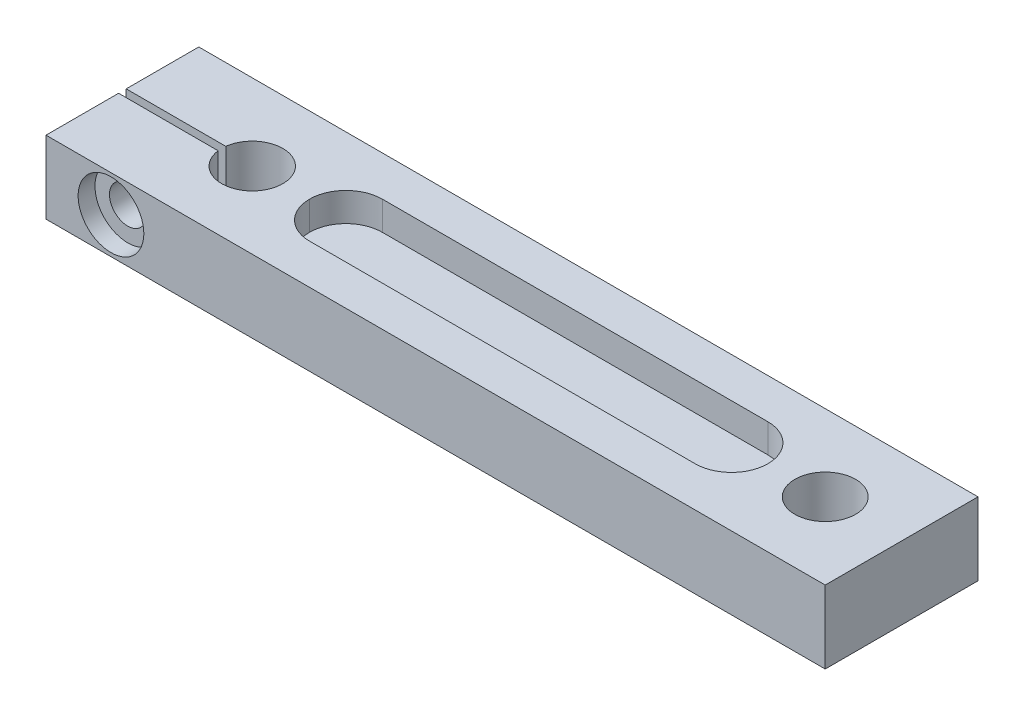
ISO-10303-21;
HEADER;
FILE_DESCRIPTION(('STEP AP214'),'2;1');
FILE_NAME('part.step','',(''),(''),'','','');
FILE_SCHEMA(('AUTOMOTIVE_DESIGN { 1 0 10303 214 1 1 1 1 }'));
ENDSEC;
DATA;
#1=APPLICATION_CONTEXT('core data for automotive mechanical design processes');
#2=APPLICATION_PROTOCOL_DEFINITION('international standard','automotive_design',2000,#1);
#3=PRODUCT_CONTEXT('',#1,'mechanical');
#4=PRODUCT('Part','Part','',(#3));
#5=PRODUCT_RELATED_PRODUCT_CATEGORY('part','',(#4));
#6=PRODUCT_DEFINITION_FORMATION('','',#4);
#7=PRODUCT_DEFINITION_CONTEXT('part definition',#1,'design');
#8=PRODUCT_DEFINITION('design','',#6,#7);
#9=PRODUCT_DEFINITION_SHAPE('','',#8);
#10=(LENGTH_UNIT() NAMED_UNIT(*) SI_UNIT(.MILLI.,.METRE.));
#11=(NAMED_UNIT(*) PLANE_ANGLE_UNIT() SI_UNIT($,.RADIAN.));
#12=(NAMED_UNIT(*) SI_UNIT($,.STERADIAN.) SOLID_ANGLE_UNIT());
#13=UNCERTAINTY_MEASURE_WITH_UNIT(LENGTH_MEASURE(1.E-05),#10,'distance_accuracy_value','');
#14=(GEOMETRIC_REPRESENTATION_CONTEXT(3) GLOBAL_UNCERTAINTY_ASSIGNED_CONTEXT((#13)) GLOBAL_UNIT_ASSIGNED_CONTEXT((#10,
#11,#12)) REPRESENTATION_CONTEXT('',''));
#15=CARTESIAN_POINT('',(0.,0.,0.));
#16=DIRECTION('',(0.,0.,1.));
#17=DIRECTION('',(1.,0.,0.));
#18=AXIS2_PLACEMENT_3D('',#15,#16,#17);
#19=CARTESIAN_POINT('',(-17.,34.925,0.));
#20=DIRECTION('',(-1.,0.,0.));
#21=DIRECTION('',(0.,0.,1.));
#22=AXIS2_PLACEMENT_3D('',#19,#20,#21);
#23=PLANE('',#22);
#24=DIRECTION('',(0.,1.,0.));
#25=VECTOR('',#24,1.);
#26=CARTESIAN_POINT('',(-17.,0.,-0.499999999999998));
#27=LINE('',#26,#25);
#28=CARTESIAN_POINT('',(-17.,25.4,-0.499999999999998));
#29=VERTEX_POINT('',#28);
#30=CARTESIAN_POINT('',(-17.,34.925,-0.499999999999998));
#31=VERTEX_POINT('',#30);
#32=EDGE_CURVE('E181',#29,#31,#27,.T.);
#33=ORIENTED_EDGE('',*,*,#32,.T.);
#34=DIRECTION('',(0.,0.,-1.));
#35=VECTOR('',#34,1.);
#36=CARTESIAN_POINT('',(-17.,34.925,0.));
#37=LINE('',#36,#35);
#38=CARTESIAN_POINT('',(-17.,34.925,-10.));
#39=VERTEX_POINT('',#38);
#40=EDGE_CURVE('E201',#31,#39,#37,.T.);
#41=ORIENTED_EDGE('',*,*,#40,.T.);
#42=DIRECTION('',(0.,-1.,0.));
#43=VECTOR('',#42,1.);
#44=CARTESIAN_POINT('',(-17.,34.925,-10.));
#45=LINE('',#44,#43);
#46=CARTESIAN_POINT('',(-17.,25.4,-10.));
#47=VERTEX_POINT('',#46);
#48=EDGE_CURVE('E222',#39,#47,#45,.T.);
#49=ORIENTED_EDGE('',*,*,#48,.T.);
#50=DIRECTION('',(0.,0.,-1.));
#51=VECTOR('',#50,1.);
#52=CARTESIAN_POINT('',(-17.,25.4,0.));
#53=LINE('',#52,#51);
#54=EDGE_CURVE('E218',#29,#47,#53,.T.);
#55=ORIENTED_EDGE('',*,*,#54,.F.);
#56=EDGE_LOOP('',(#33,#41,#49,#55));
#57=FACE_BOUND('',#56,.T.);
#58=ADVANCED_FACE('F39',(#57),#23,.T.);
#59=CARTESIAN_POINT('',(0.,34.925,0.));
#60=DIRECTION('',(0.,-1.,0.));
#61=DIRECTION('',(0.,0.,-1.));
#62=AXIS2_PLACEMENT_3D('',#59,#60,#61);
#63=PLANE('',#62);
#64=ORIENTED_EDGE('',*,*,#40,.F.);
#65=DIRECTION('',(-1.,0.,0.));
#66=VECTOR('',#65,1.);
#67=CARTESIAN_POINT('',(-17.,34.925,-0.499999999999998));
#68=LINE('',#67,#66);
#69=CARTESIAN_POINT('',(-3.96862696659689,34.925,-0.5));
#70=VERTEX_POINT('',#69);
#71=EDGE_CURVE('E182',#70,#31,#68,.T.);
#72=ORIENTED_EDGE('',*,*,#71,.F.);
#73=CARTESIAN_POINT('',(0.,34.925,0.));
#74=DIRECTION('',(0.,-1.,0.));
#75=DIRECTION('',(0.,0.,-1.));
#76=AXIS2_PLACEMENT_3D('',#73,#74,#75);
#77=CIRCLE('',#76,4.);
#78=CARTESIAN_POINT('',(-3.96862696659689,34.925,0.5));
#79=VERTEX_POINT('',#78);
#80=EDGE_CURVE('E194',#70,#79,#77,.T.);
#81=ORIENTED_EDGE('',*,*,#80,.T.);
#82=DIRECTION('',(1.,0.,0.));
#83=VECTOR('',#82,1.);
#84=CARTESIAN_POINT('',(-17.,34.925,0.500000000000002));
#85=LINE('',#84,#83);
#86=CARTESIAN_POINT('',(-17.,34.925,0.500000000000002));
#87=VERTEX_POINT('',#86);
#88=EDGE_CURVE('E61',#87,#79,#85,.T.);
#89=ORIENTED_EDGE('',*,*,#88,.F.);
#90=CARTESIAN_POINT('',(-17.,34.925,10.));
#91=VERTEX_POINT('',#90);
#92=EDGE_CURVE('E191',#91,#87,#37,.T.);
#93=ORIENTED_EDGE('',*,*,#92,.F.);
#94=DIRECTION('',(-1.,0.,0.));
#95=VECTOR('',#94,1.);
#96=CARTESIAN_POINT('',(0.,34.925,10.));
#97=LINE('',#96,#95);
#98=CARTESIAN_POINT('',(85.,34.925,10.));
#99=VERTEX_POINT('',#98);
#100=EDGE_CURVE('E205',#99,#91,#97,.T.);
#101=ORIENTED_EDGE('',*,*,#100,.F.);
#102=DIRECTION('',(0.,0.,1.));
#103=VECTOR('',#102,1.);
#104=CARTESIAN_POINT('',(85.,34.925,0.));
#105=LINE('',#104,#103);
#106=CARTESIAN_POINT('',(85.,34.925,-10.));
#107=VERTEX_POINT('',#106);
#108=EDGE_CURVE('E336',#107,#99,#105,.T.);
#109=ORIENTED_EDGE('',*,*,#108,.F.);
#110=DIRECTION('',(1.,0.,0.));
#111=VECTOR('',#110,1.);
#112=CARTESIAN_POINT('',(0.,34.925,-10.));
#113=LINE('',#112,#111);
#114=EDGE_CURVE('E221',#39,#107,#113,.T.);
#115=ORIENTED_EDGE('',*,*,#114,.F.);
#116=EDGE_LOOP('',(#64,#72,#81,#89,#93,#101,#109,#115));
#117=FACE_BOUND('',#116,.T.);
#118=CARTESIAN_POINT('',(75.,34.925,0.));
#119=DIRECTION('',(0.,-1.,0.));
#120=DIRECTION('',(0.,0.,-1.));
#121=AXIS2_PLACEMENT_3D('',#118,#119,#120);
#122=CIRCLE('',#121,3.97500000000001);
#123=CARTESIAN_POINT('',(75.,34.925,-3.97500000000001));
#124=VERTEX_POINT('',#123);
#125=EDGE_CURVE('E328',#124,#124,#122,.T.);
#126=ORIENTED_EDGE('',*,*,#125,.T.);
#127=EDGE_LOOP('',(#126));
#128=FACE_BOUND('',#127,.T.);
#129=DIRECTION('',(-1.,0.,0.));
#130=VECTOR('',#129,1.);
#131=CARTESIAN_POINT('',(0.,34.925,-4.7625));
#132=LINE('',#131,#130);
#133=CARTESIAN_POINT('',(62.7375,34.925,-4.7625));
#134=VERTEX_POINT('',#133);
#135=CARTESIAN_POINT('',(12.2625,34.925,-4.7625));
#136=VERTEX_POINT('',#135);
#137=EDGE_CURVE('E316',#134,#136,#132,.T.);
#138=ORIENTED_EDGE('',*,*,#137,.F.);
#139=CARTESIAN_POINT('',(62.7375,34.925,0.));
#140=DIRECTION('',(0.,-1.,0.));
#141=DIRECTION('',(0.,0.,-1.));
#142=AXIS2_PLACEMENT_3D('',#139,#140,#141);
#143=CIRCLE('',#142,4.7625);
#144=CARTESIAN_POINT('',(67.5,34.925,0.));
#145=VERTEX_POINT('',#144);
#146=EDGE_CURVE('E273',#134,#145,#143,.T.);
#147=ORIENTED_EDGE('',*,*,#146,.T.);
#148=CARTESIAN_POINT('',(62.7375,34.925,0.));
#149=DIRECTION('',(0.,-1.,0.));
#150=DIRECTION('',(0.,0.,-1.));
#151=AXIS2_PLACEMENT_3D('',#148,#149,#150);
#152=CIRCLE('',#151,4.7625);
#153=CARTESIAN_POINT('',(62.7375,34.925,4.7625));
#154=VERTEX_POINT('',#153);
#155=EDGE_CURVE('E271',#145,#154,#152,.T.);
#156=ORIENTED_EDGE('',*,*,#155,.T.);
#157=DIRECTION('',(1.,0.,0.));
#158=VECTOR('',#157,1.);
#159=CARTESIAN_POINT('',(0.,34.925,4.7625));
#160=LINE('',#159,#158);
#161=CARTESIAN_POINT('',(12.2625,34.925,4.7625));
#162=VERTEX_POINT('',#161);
#163=EDGE_CURVE('E319',#162,#154,#160,.T.);
#164=ORIENTED_EDGE('',*,*,#163,.F.);
#165=CARTESIAN_POINT('',(12.2625,34.925,0.));
#166=DIRECTION('',(0.,-1.,0.));
#167=DIRECTION('',(0.,0.,-1.));
#168=AXIS2_PLACEMENT_3D('',#165,#166,#167);
#169=CIRCLE('',#168,4.7625);
#170=CARTESIAN_POINT('',(7.5,34.925,0.));
#171=VERTEX_POINT('',#170);
#172=EDGE_CURVE('E275',#162,#171,#169,.T.);
#173=ORIENTED_EDGE('',*,*,#172,.T.);
#174=CARTESIAN_POINT('',(12.2625,34.925,0.));
#175=DIRECTION('',(0.,-1.,0.));
#176=DIRECTION('',(0.,0.,-1.));
#177=AXIS2_PLACEMENT_3D('',#174,#175,#176);
#178=CIRCLE('',#177,4.7625);
#179=EDGE_CURVE('E277',#171,#136,#178,.T.);
#180=ORIENTED_EDGE('',*,*,#179,.T.);
#181=EDGE_LOOP('',(#138,#147,#156,#164,#173,#180));
#182=FACE_BOUND('',#181,.T.);
#183=ADVANCED_FACE('F188',(#117,#128,#182),#63,.F.);
#184=CARTESIAN_POINT('',(0.,34.925,-10.));
#185=DIRECTION('',(0.,0.,-1.));
#186=DIRECTION('',(-1.,0.,0.));
#187=AXIS2_PLACEMENT_3D('',#184,#185,#186);
#188=PLANE('',#187);
#189=CARTESIAN_POINT('',(-8.49215674164922,30.1625,-10.));
#190=DIRECTION('',(0.,0.,-1.));
#191=DIRECTION('',(-1.,0.,0.));
#192=AXIS2_PLACEMENT_3D('',#189,#190,#191);
#193=CIRCLE('',#192,1.65);
#194=CARTESIAN_POINT('',(-10.1421567416492,30.1625,-10.));
#195=VERTEX_POINT('',#194);
#196=EDGE_CURVE('E365',#195,#195,#193,.T.);
#197=ORIENTED_EDGE('',*,*,#196,.F.);
#198=EDGE_LOOP('',(#197));
#199=FACE_BOUND('',#198,.T.);
#200=DIRECTION('',(1.,0.,0.));
#201=VECTOR('',#200,1.);
#202=CARTESIAN_POINT('',(0.,25.4,-10.));
#203=LINE('',#202,#201);
#204=CARTESIAN_POINT('',(85.,25.4,-10.));
#205=VERTEX_POINT('',#204);
#206=EDGE_CURVE('E209',#47,#205,#203,.T.);
#207=ORIENTED_EDGE('',*,*,#206,.F.);
#208=ORIENTED_EDGE('',*,*,#48,.F.);
#209=ORIENTED_EDGE('',*,*,#114,.T.);
#210=DIRECTION('',(0.,-1.,0.));
#211=VECTOR('',#210,1.);
#212=CARTESIAN_POINT('',(85.,34.925,-10.));
#213=LINE('',#212,#211);
#214=EDGE_CURVE('E200',#107,#205,#213,.T.);
#215=ORIENTED_EDGE('',*,*,#214,.T.);
#216=EDGE_LOOP('',(#207,#208,#209,#215));
#217=FACE_BOUND('',#216,.T.);
#218=ADVANCED_FACE('F347',(#199,#217),#188,.T.);
#219=DIRECTION('',(0.,1.,0.));
#220=VECTOR('',#219,1.);
#221=CARTESIAN_POINT('',(-17.,0.,0.500000000000002));
#222=LINE('',#221,#220);
#223=CARTESIAN_POINT('',(-17.,25.4,0.500000000000002));
#224=VERTEX_POINT('',#223);
#225=EDGE_CURVE('E173',#224,#87,#222,.T.);
#226=ORIENTED_EDGE('',*,*,#225,.F.);
#227=CARTESIAN_POINT('',(-17.,25.4,10.));
#228=VERTEX_POINT('',#227);
#229=EDGE_CURVE('E219',#228,#224,#53,.T.);
#230=ORIENTED_EDGE('',*,*,#229,.F.);
#231=DIRECTION('',(0.,-1.,0.));
#232=VECTOR('',#231,1.);
#233=CARTESIAN_POINT('',(-17.,34.925,10.));
#234=LINE('',#233,#232);
#235=EDGE_CURVE('E198',#91,#228,#234,.T.);
#236=ORIENTED_EDGE('',*,*,#235,.F.);
#237=ORIENTED_EDGE('',*,*,#92,.T.);
#238=EDGE_LOOP('',(#226,#230,#236,#237));
#239=FACE_BOUND('',#238,.T.);
#240=ADVANCED_FACE('F197',(#239),#23,.T.);
#241=CARTESIAN_POINT('',(0.,34.925,10.));
#242=DIRECTION('',(0.,0.,1.));
#243=DIRECTION('',(1.,0.,0.));
#244=AXIS2_PLACEMENT_3D('',#241,#242,#243);
#245=PLANE('',#244);
#246=CARTESIAN_POINT('',(-8.49215674164922,30.1625,10.));
#247=DIRECTION('',(0.,0.,1.));
#248=DIRECTION('',(1.,0.,0.));
#249=AXIS2_PLACEMENT_3D('',#246,#247,#248);
#250=CIRCLE('',#249,4.3);
#251=CARTESIAN_POINT('',(-4.19215674164922,30.1625,10.));
#252=VERTEX_POINT('',#251);
#253=EDGE_CURVE('E361',#252,#252,#250,.T.);
#254=ORIENTED_EDGE('',*,*,#253,.F.);
#255=EDGE_LOOP('',(#254));
#256=FACE_BOUND('',#255,.T.);
#257=DIRECTION('',(-1.,0.,0.));
#258=VECTOR('',#257,1.);
#259=CARTESIAN_POINT('',(0.,25.4,10.));
#260=LINE('',#259,#258);
#261=CARTESIAN_POINT('',(85.,25.4,10.));
#262=VERTEX_POINT('',#261);
#263=EDGE_CURVE('E215',#262,#228,#260,.T.);
#264=ORIENTED_EDGE('',*,*,#263,.F.);
#265=DIRECTION('',(0.,-1.,0.));
#266=VECTOR('',#265,1.);
#267=CARTESIAN_POINT('',(85.,34.925,10.));
#268=LINE('',#267,#266);
#269=EDGE_CURVE('E203',#99,#262,#268,.T.);
#270=ORIENTED_EDGE('',*,*,#269,.F.);
#271=ORIENTED_EDGE('',*,*,#100,.T.);
#272=ORIENTED_EDGE('',*,*,#235,.T.);
#273=EDGE_LOOP('',(#264,#270,#271,#272));
#274=FACE_BOUND('',#273,.T.);
#275=ADVANCED_FACE('F342',(#256,#274),#245,.T.);
#276=CARTESIAN_POINT('',(85.,34.925,0.));
#277=DIRECTION('',(1.,0.,0.));
#278=DIRECTION('',(0.,0.,-1.));
#279=AXIS2_PLACEMENT_3D('',#276,#277,#278);
#280=PLANE('',#279);
#281=DIRECTION('',(0.,0.,1.));
#282=VECTOR('',#281,1.);
#283=CARTESIAN_POINT('',(85.,25.4,0.));
#284=LINE('',#283,#282);
#285=EDGE_CURVE('E212',#205,#262,#284,.T.);
#286=ORIENTED_EDGE('',*,*,#285,.F.);
#287=ORIENTED_EDGE('',*,*,#214,.F.);
#288=ORIENTED_EDGE('',*,*,#108,.T.);
#289=ORIENTED_EDGE('',*,*,#269,.T.);
#290=EDGE_LOOP('',(#286,#287,#288,#289));
#291=FACE_BOUND('',#290,.T.);
#292=ADVANCED_FACE('F401',(#291),#280,.T.);
#293=CARTESIAN_POINT('',(0.,25.4,0.));
#294=DIRECTION('',(0.,-1.,0.));
#295=DIRECTION('',(0.,0.,-1.));
#296=AXIS2_PLACEMENT_3D('',#293,#294,#295);
#297=PLANE('',#296);
#298=DIRECTION('',(1.,0.,0.));
#299=VECTOR('',#298,1.);
#300=CARTESIAN_POINT('',(0.,25.4,-0.5));
#301=LINE('',#300,#299);
#302=CARTESIAN_POINT('',(-3.96862696659689,25.4,-0.5));
#303=VERTEX_POINT('',#302);
#304=EDGE_CURVE('E54',#29,#303,#301,.T.);
#305=ORIENTED_EDGE('',*,*,#304,.F.);
#306=ORIENTED_EDGE('',*,*,#54,.T.);
#307=ORIENTED_EDGE('',*,*,#206,.T.);
#308=ORIENTED_EDGE('',*,*,#285,.T.);
#309=ORIENTED_EDGE('',*,*,#263,.T.);
#310=ORIENTED_EDGE('',*,*,#229,.T.);
#311=DIRECTION('',(-1.,0.,0.));
#312=VECTOR('',#311,1.);
#313=CARTESIAN_POINT('',(0.,25.4,0.5));
#314=LINE('',#313,#312);
#315=CARTESIAN_POINT('',(-3.96862696659689,25.4,0.5));
#316=VERTEX_POINT('',#315);
#317=EDGE_CURVE('E176',#316,#224,#314,.T.);
#318=ORIENTED_EDGE('',*,*,#317,.F.);
#319=CARTESIAN_POINT('',(0.,25.4,0.));
#320=DIRECTION('',(0.,-1.,0.));
#321=DIRECTION('',(0.,0.,-1.));
#322=AXIS2_PLACEMENT_3D('',#319,#320,#321);
#323=CIRCLE('',#322,4.);
#324=EDGE_CURVE('E295',#303,#316,#323,.T.);
#325=ORIENTED_EDGE('',*,*,#324,.F.);
#326=EDGE_LOOP('',(#305,#306,#307,#308,#309,#310,#318,#325));
#327=FACE_BOUND('',#326,.T.);
#328=CARTESIAN_POINT('',(62.7375,25.4,0.));
#329=DIRECTION('',(0.,-1.,0.));
#330=DIRECTION('',(0.,0.,-1.));
#331=AXIS2_PLACEMENT_3D('',#328,#329,#330);
#332=CIRCLE('',#331,4.7625);
#333=CARTESIAN_POINT('',(62.7375,25.4,4.7625));
#334=VERTEX_POINT('',#333);
#335=CARTESIAN_POINT('',(67.5,25.4,0.));
#336=VERTEX_POINT('',#335);
#337=EDGE_CURVE('E267',#334,#336,#332,.F.);
#338=ORIENTED_EDGE('',*,*,#337,.T.);
#339=CARTESIAN_POINT('',(62.7375,25.4,0.));
#340=DIRECTION('',(0.,-1.,0.));
#341=DIRECTION('',(0.,0.,-1.));
#342=AXIS2_PLACEMENT_3D('',#339,#340,#341);
#343=CIRCLE('',#342,4.7625);
#344=CARTESIAN_POINT('',(62.7375,25.4,-4.7625));
#345=VERTEX_POINT('',#344);
#346=EDGE_CURVE('E269',#336,#345,#343,.F.);
#347=ORIENTED_EDGE('',*,*,#346,.T.);
#348=DIRECTION('',(-1.,0.,0.));
#349=VECTOR('',#348,1.);
#350=CARTESIAN_POINT('',(0.,25.4,-4.7625));
#351=LINE('',#350,#349);
#352=CARTESIAN_POINT('',(12.2625,25.4,-4.7625));
#353=VERTEX_POINT('',#352);
#354=EDGE_CURVE('E307',#345,#353,#351,.T.);
#355=ORIENTED_EDGE('',*,*,#354,.T.);
#356=CARTESIAN_POINT('',(12.2625,25.4,0.));
#357=DIRECTION('',(0.,-1.,0.));
#358=DIRECTION('',(0.,0.,-1.));
#359=AXIS2_PLACEMENT_3D('',#356,#357,#358);
#360=CIRCLE('',#359,4.7625);
#361=CARTESIAN_POINT('',(7.5,25.4,0.));
#362=VERTEX_POINT('',#361);
#363=EDGE_CURVE('E265',#353,#362,#360,.F.);
#364=ORIENTED_EDGE('',*,*,#363,.T.);
#365=CARTESIAN_POINT('',(12.2625,25.4,0.));
#366=DIRECTION('',(0.,-1.,0.));
#367=DIRECTION('',(0.,0.,-1.));
#368=AXIS2_PLACEMENT_3D('',#365,#366,#367);
#369=CIRCLE('',#368,4.7625);
#370=CARTESIAN_POINT('',(12.2625,25.4,4.7625));
#371=VERTEX_POINT('',#370);
#372=EDGE_CURVE('E263',#362,#371,#369,.F.);
#373=ORIENTED_EDGE('',*,*,#372,.T.);
#374=DIRECTION('',(1.,0.,0.));
#375=VECTOR('',#374,1.);
#376=CARTESIAN_POINT('',(0.,25.4,4.7625));
#377=LINE('',#376,#375);
#378=EDGE_CURVE('E304',#371,#334,#377,.T.);
#379=ORIENTED_EDGE('',*,*,#378,.T.);
#380=EDGE_LOOP('',(#338,#347,#355,#364,#373,#379));
#381=FACE_BOUND('',#380,.T.);
#382=CARTESIAN_POINT('',(75.,25.4,0.));
#383=DIRECTION('',(0.,-1.,0.));
#384=DIRECTION('',(0.,0.,-1.));
#385=AXIS2_PLACEMENT_3D('',#382,#383,#384);
#386=CIRCLE('',#385,3.97500000000001);
#387=CARTESIAN_POINT('',(75.,25.4,-3.97500000000001));
#388=VERTEX_POINT('',#387);
#389=EDGE_CURVE('E323',#388,#388,#386,.T.);
#390=ORIENTED_EDGE('',*,*,#389,.F.);
#391=EDGE_LOOP('',(#390));
#392=FACE_BOUND('',#391,.T.);
#393=ADVANCED_FACE('F297',(#327,#381,#392),#297,.T.);
#394=CARTESIAN_POINT('',(0.,34.925,0.));
#395=DIRECTION('',(0.,-1.,0.));
#396=DIRECTION('',(0.,0.,-1.));
#397=AXIS2_PLACEMENT_3D('',#394,#395,#396);
#398=CYLINDRICAL_SURFACE('',#397,4.);
#399=ORIENTED_EDGE('',*,*,#80,.F.);
#400=DIRECTION('',(0.,-1.,0.));
#401=VECTOR('',#400,1.);
#402=CARTESIAN_POINT('',(-3.96862696659689,34.925,-0.5));
#403=LINE('',#402,#401);
#404=EDGE_CURVE('E11',#70,#303,#403,.T.);
#405=ORIENTED_EDGE('',*,*,#404,.T.);
#406=ORIENTED_EDGE('',*,*,#324,.T.);
#407=DIRECTION('',(0.,-1.,0.));
#408=VECTOR('',#407,1.);
#409=CARTESIAN_POINT('',(-3.96862696659689,34.925,0.5));
#410=LINE('',#409,#408);
#411=EDGE_CURVE('E47',#316,#79,#410,.F.);
#412=ORIENTED_EDGE('',*,*,#411,.T.);
#413=EDGE_LOOP('',(#399,#405,#406,#412));
#414=FACE_BOUND('',#413,.T.);
#415=ADVANCED_FACE('F293',(#414),#398,.F.);
#416=CARTESIAN_POINT('',(75.,34.925,0.));
#417=DIRECTION('',(0.,-1.,0.));
#418=DIRECTION('',(0.,0.,-1.));
#419=AXIS2_PLACEMENT_3D('',#416,#417,#418);
#420=CYLINDRICAL_SURFACE('',#419,3.97500000000001);
#421=CARTESIAN_POINT('',(75.,34.925,-3.97500000000001));
#422=CARTESIAN_POINT('',(75.,34.82578125,-3.97500000000001));
#423=CARTESIAN_POINT('',(75.,34.7265625,-3.97500000000001));
#424=CARTESIAN_POINT('',(75.,34.528125,-3.97500000000001));
#425=CARTESIAN_POINT('',(75.,34.42890625,-3.97500000000001));
#426=CARTESIAN_POINT('',(75.,34.23046875,-3.97500000000001));
#427=CARTESIAN_POINT('',(75.,34.13125,-3.97500000000001));
#428=CARTESIAN_POINT('',(75.,33.9328125,-3.97500000000001));
#429=CARTESIAN_POINT('',(75.,33.83359375,-3.97500000000001));
#430=CARTESIAN_POINT('',(75.,33.63515625,-3.97500000000001));
#431=CARTESIAN_POINT('',(75.,33.5359375,-3.97500000000001));
#432=CARTESIAN_POINT('',(75.,33.3375,-3.97500000000001));
#433=CARTESIAN_POINT('',(75.,33.23828125,-3.97500000000001));
#434=CARTESIAN_POINT('',(75.,33.03984375,-3.97500000000001));
#435=CARTESIAN_POINT('',(75.,32.940625,-3.97500000000001));
#436=CARTESIAN_POINT('',(75.,32.7421875,-3.97500000000001));
#437=CARTESIAN_POINT('',(75.,32.64296875,-3.97500000000001));
#438=CARTESIAN_POINT('',(75.,32.44453125,-3.97500000000001));
#439=CARTESIAN_POINT('',(75.,32.3453125,-3.97500000000001));
#440=CARTESIAN_POINT('',(75.,32.146875,-3.97500000000001));
#441=CARTESIAN_POINT('',(75.,32.04765625,-3.97500000000001));
#442=CARTESIAN_POINT('',(75.,31.84921875,-3.97500000000001));
#443=CARTESIAN_POINT('',(75.,31.75,-3.97500000000001));
#444=CARTESIAN_POINT('',(75.,31.5515625,-3.97500000000001));
#445=CARTESIAN_POINT('',(75.,31.45234375,-3.97500000000001));
#446=CARTESIAN_POINT('',(75.,31.25390625,-3.97500000000001));
#447=CARTESIAN_POINT('',(75.,31.1546875,-3.97500000000001));
#448=CARTESIAN_POINT('',(75.,30.95625,-3.97500000000001));
#449=CARTESIAN_POINT('',(75.,30.85703125,-3.97500000000001));
#450=CARTESIAN_POINT('',(75.,30.65859375,-3.97500000000001));
#451=CARTESIAN_POINT('',(75.,30.559375,-3.97500000000001));
#452=CARTESIAN_POINT('',(75.,30.3609375,-3.97500000000001));
#453=CARTESIAN_POINT('',(75.,30.26171875,-3.97500000000001));
#454=CARTESIAN_POINT('',(75.,30.06328125,-3.97500000000001));
#455=CARTESIAN_POINT('',(75.,29.9640625,-3.97500000000001));
#456=CARTESIAN_POINT('',(75.,29.765625,-3.97500000000001));
#457=CARTESIAN_POINT('',(75.,29.66640625,-3.97500000000001));
#458=CARTESIAN_POINT('',(75.,29.46796875,-3.97500000000001));
#459=CARTESIAN_POINT('',(75.,29.36875,-3.97500000000001));
#460=CARTESIAN_POINT('',(75.,29.1703125,-3.97500000000001));
#461=CARTESIAN_POINT('',(75.,29.07109375,-3.97500000000001));
#462=CARTESIAN_POINT('',(75.,28.87265625,-3.97500000000001));
#463=CARTESIAN_POINT('',(75.,28.7734375,-3.97500000000001));
#464=CARTESIAN_POINT('',(75.,28.575,-3.97500000000001));
#465=CARTESIAN_POINT('',(75.,28.47578125,-3.97500000000001));
#466=CARTESIAN_POINT('',(75.,28.27734375,-3.97500000000001));
#467=CARTESIAN_POINT('',(75.,28.178125,-3.97500000000001));
#468=CARTESIAN_POINT('',(75.,27.9796875,-3.97500000000001));
#469=CARTESIAN_POINT('',(75.,27.88046875,-3.97500000000001));
#470=CARTESIAN_POINT('',(75.,27.68203125,-3.97500000000001));
#471=CARTESIAN_POINT('',(75.,27.5828125,-3.97500000000001));
#472=CARTESIAN_POINT('',(75.,27.384375,-3.97500000000001));
#473=CARTESIAN_POINT('',(75.,27.28515625,-3.97500000000001));
#474=CARTESIAN_POINT('',(75.,27.08671875,-3.97500000000001));
#475=CARTESIAN_POINT('',(75.,26.9875,-3.97500000000001));
#476=CARTESIAN_POINT('',(75.,26.7890625,-3.97500000000001));
#477=CARTESIAN_POINT('',(75.,26.68984375,-3.97500000000001));
#478=CARTESIAN_POINT('',(75.,26.49140625,-3.97500000000001));
#479=CARTESIAN_POINT('',(75.,26.3921875,-3.97500000000001));
#480=CARTESIAN_POINT('',(75.,26.19375,-3.97500000000001));
#481=CARTESIAN_POINT('',(75.,26.09453125,-3.97500000000001));
#482=CARTESIAN_POINT('',(75.,25.89609375,-3.97500000000001));
#483=CARTESIAN_POINT('',(75.,25.796875,-3.97500000000001));
#484=CARTESIAN_POINT('',(75.,25.5984375,-3.97500000000001));
#485=CARTESIAN_POINT('',(75.,25.49921875,-3.97500000000001));
#486=CARTESIAN_POINT('',(75.,25.4,-3.97500000000001));
#487=B_SPLINE_CURVE_WITH_KNOTS('',3,(#421,#422,#423,#424,#425,#426,#427,#428,#429,#430,#431,
#432,#433,#434,#435,#436,#437,#438,#439,#440,#441,#442,#443,#444,#445,#446,#447,#448,#449,#450,
#451,#452,#453,#454,#455,#456,#457,#458,#459,#460,#461,#462,#463,#464,#465,#466,#467,#468,#469,
#470,#471,#472,#473,#474,#475,#476,#477,#478,#479,#480,#481,#482,#483,#484,#485,#486),
.UNSPECIFIED.,.F.,.F.,(4,2,2,2,2,2,2,2,2,2,2,2,2,2,2,2,2,2,2,2,2,2,2,2,2,2,2,2,2,2,2,2,4),(0.,
0.297656249999993,0.595312499999993,0.892968749999994,1.19062499999999,1.48828124999999,
1.78593749999999,2.08359374999999,2.38124999999999,2.67890624999999,2.97656249999999,
3.27421874999999,3.571875,3.86953125,4.1671875,4.46484375,4.7625,5.06015625,5.3578125,
5.65546875,5.953125,6.25078125,6.5484375,6.84609375,7.14375,7.44140625,7.7390625,8.03671875,
8.334375,8.63203125,8.9296875,9.22734375,9.525),.UNSPECIFIED.);
#488=EDGE_CURVE('BSEAM464',#124,#388,#487,.T.);
#489=ORIENTED_EDGE('',*,*,#125,.F.);
#490=ORIENTED_EDGE('',*,*,#389,.T.);
#491=ORIENTED_EDGE('',*,*,#488,.T.);
#492=ORIENTED_EDGE('',*,*,#488,.F.);
#493=EDGE_LOOP('',(#489,#491,#490,#492));
#494=FACE_BOUND('',#493,.T.);
#495=ADVANCED_FACE('F464',(#494),#420,.F.);
#496=CARTESIAN_POINT('',(0.,34.925,-4.7625));
#497=DIRECTION('',(0.,0.,1.));
#498=DIRECTION('',(1.,0.,0.));
#499=AXIS2_PLACEMENT_3D('',#496,#497,#498);
#500=PLANE('',#499);
#501=DIRECTION('',(-1.,0.,0.));
#502=VECTOR('',#501,1.);
#503=CARTESIAN_POINT('',(0.,31.1625,-4.7625));
#504=LINE('',#503,#502);
#505=CARTESIAN_POINT('',(62.7375,31.1625,-4.7625));
#506=VERTEX_POINT('',#505);
#507=CARTESIAN_POINT('',(12.2625,31.1625,-4.7625));
#508=VERTEX_POINT('',#507);
#509=EDGE_CURVE('E311',#506,#508,#504,.T.);
#510=ORIENTED_EDGE('',*,*,#509,.F.);
#511=DIRECTION('',(0.,-1.,0.));
#512=VECTOR('',#511,1.);
#513=CARTESIAN_POINT('',(62.7375,34.925,-4.7625));
#514=LINE('',#513,#512);
#515=EDGE_CURVE('E261',#506,#134,#514,.F.);
#516=ORIENTED_EDGE('',*,*,#515,.T.);
#517=ORIENTED_EDGE('',*,*,#137,.T.);
#518=DIRECTION('',(0.,-1.,0.));
#519=VECTOR('',#518,1.);
#520=CARTESIAN_POINT('',(12.2625,31.1625,-4.7625));
#521=LINE('',#520,#519);
#522=EDGE_CURVE('E259',#136,#508,#521,.T.);
#523=ORIENTED_EDGE('',*,*,#522,.T.);
#524=EDGE_LOOP('',(#510,#516,#517,#523));
#525=FACE_BOUND('',#524,.T.);
#526=ADVANCED_FACE('F461',(#525),#500,.T.);
#527=CARTESIAN_POINT('',(0.,34.925,4.7625));
#528=DIRECTION('',(0.,0.,-1.));
#529=DIRECTION('',(-1.,0.,0.));
#530=AXIS2_PLACEMENT_3D('',#527,#528,#529);
#531=PLANE('',#530);
#532=ORIENTED_EDGE('',*,*,#163,.T.);
#533=DIRECTION('',(0.,-1.,0.));
#534=VECTOR('',#533,1.);
#535=CARTESIAN_POINT('',(62.7375,31.1625,4.7625));
#536=LINE('',#535,#534);
#537=CARTESIAN_POINT('',(62.7375,31.1625,4.7625));
#538=VERTEX_POINT('',#537);
#539=EDGE_CURVE('E248',#154,#538,#536,.T.);
#540=ORIENTED_EDGE('',*,*,#539,.T.);
#541=DIRECTION('',(1.,0.,0.));
#542=VECTOR('',#541,1.);
#543=CARTESIAN_POINT('',(0.,31.1625,4.7625));
#544=LINE('',#543,#542);
#545=CARTESIAN_POINT('',(12.2625,31.1625,4.7625));
#546=VERTEX_POINT('',#545);
#547=EDGE_CURVE('E320',#546,#538,#544,.T.);
#548=ORIENTED_EDGE('',*,*,#547,.F.);
#549=DIRECTION('',(0.,-1.,0.));
#550=VECTOR('',#549,1.);
#551=CARTESIAN_POINT('',(12.2625,34.925,4.7625));
#552=LINE('',#551,#550);
#553=EDGE_CURVE('E245',#546,#162,#552,.F.);
#554=ORIENTED_EDGE('',*,*,#553,.T.);
#555=EDGE_LOOP('',(#532,#540,#548,#554));
#556=FACE_BOUND('',#555,.T.);
#557=ADVANCED_FACE('F448',(#556),#531,.T.);
#558=CARTESIAN_POINT('',(0.,31.1625,0.));
#559=DIRECTION('',(0.,1.,0.));
#560=DIRECTION('',(0.,0.,1.));
#561=AXIS2_PLACEMENT_3D('',#558,#559,#560);
#562=PLANE('',#561);
#563=ORIENTED_EDGE('',*,*,#547,.T.);
#564=CARTESIAN_POINT('',(62.7375,31.1625,0.));
#565=DIRECTION('',(0.,1.,0.));
#566=DIRECTION('',(0.,0.,1.));
#567=AXIS2_PLACEMENT_3D('',#564,#565,#566);
#568=CIRCLE('',#567,4.7625);
#569=CARTESIAN_POINT('',(67.5,31.1625,0.));
#570=VERTEX_POINT('',#569);
#571=EDGE_CURVE('E257',#538,#570,#568,.T.);
#572=ORIENTED_EDGE('',*,*,#571,.T.);
#573=CARTESIAN_POINT('',(62.7375,31.1625,0.));
#574=DIRECTION('',(0.,1.,0.));
#575=DIRECTION('',(0.,0.,1.));
#576=AXIS2_PLACEMENT_3D('',#573,#574,#575);
#577=CIRCLE('',#576,4.7625);
#578=EDGE_CURVE('E255',#570,#506,#577,.T.);
#579=ORIENTED_EDGE('',*,*,#578,.T.);
#580=ORIENTED_EDGE('',*,*,#509,.T.);
#581=CARTESIAN_POINT('',(12.2625,31.1625,0.));
#582=DIRECTION('',(0.,1.,0.));
#583=DIRECTION('',(0.,0.,1.));
#584=AXIS2_PLACEMENT_3D('',#581,#582,#583);
#585=CIRCLE('',#584,4.7625);
#586=CARTESIAN_POINT('',(7.5,31.1625,0.));
#587=VERTEX_POINT('',#586);
#588=EDGE_CURVE('E251',#508,#587,#585,.T.);
#589=ORIENTED_EDGE('',*,*,#588,.T.);
#590=CARTESIAN_POINT('',(12.2625,31.1625,0.));
#591=DIRECTION('',(0.,1.,0.));
#592=DIRECTION('',(0.,0.,1.));
#593=AXIS2_PLACEMENT_3D('',#590,#591,#592);
#594=CIRCLE('',#593,4.7625);
#595=EDGE_CURVE('E253',#587,#546,#594,.T.);
#596=ORIENTED_EDGE('',*,*,#595,.T.);
#597=EDGE_LOOP('',(#563,#572,#579,#580,#589,#596));
#598=FACE_BOUND('',#597,.T.);
#599=ADVANCED_FACE('F455',(#598),#562,.T.);
#600=CARTESIAN_POINT('',(0.,25.4,4.7625));
#601=DIRECTION('',(0.,0.,1.));
#602=DIRECTION('',(1.,0.,0.));
#603=AXIS2_PLACEMENT_3D('',#600,#601,#602);
#604=PLANE('',#603);
#605=ORIENTED_EDGE('',*,*,#378,.F.);
#606=DIRECTION('',(0.,1.,0.));
#607=VECTOR('',#606,1.);
#608=CARTESIAN_POINT('',(12.2625,29.1625,4.7625));
#609=LINE('',#608,#607);
#610=CARTESIAN_POINT('',(12.2625,29.1625,4.7625));
#611=VERTEX_POINT('',#610);
#612=EDGE_CURVE('E230',#371,#611,#609,.T.);
#613=ORIENTED_EDGE('',*,*,#612,.T.);
#614=DIRECTION('',(1.,0.,0.));
#615=VECTOR('',#614,1.);
#616=CARTESIAN_POINT('',(0.,29.1625,4.7625));
#617=LINE('',#616,#615);
#618=CARTESIAN_POINT('',(62.7375,29.1625,4.7625));
#619=VERTEX_POINT('',#618);
#620=EDGE_CURVE('E282',#611,#619,#617,.T.);
#621=ORIENTED_EDGE('',*,*,#620,.T.);
#622=DIRECTION('',(0.,1.,0.));
#623=VECTOR('',#622,1.);
#624=CARTESIAN_POINT('',(62.7375,25.4,4.7625));
#625=LINE('',#624,#623);
#626=EDGE_CURVE('E225',#619,#334,#625,.F.);
#627=ORIENTED_EDGE('',*,*,#626,.T.);
#628=EDGE_LOOP('',(#605,#613,#621,#627));
#629=FACE_BOUND('',#628,.T.);
#630=ADVANCED_FACE('F571',(#629),#604,.F.);
#631=CARTESIAN_POINT('',(0.,25.4,-4.7625));
#632=DIRECTION('',(0.,0.,-1.));
#633=DIRECTION('',(-1.,0.,0.));
#634=AXIS2_PLACEMENT_3D('',#631,#632,#633);
#635=PLANE('',#634);
#636=DIRECTION('',(-1.,0.,0.));
#637=VECTOR('',#636,1.);
#638=CARTESIAN_POINT('',(0.,29.1625,-4.7625));
#639=LINE('',#638,#637);
#640=CARTESIAN_POINT('',(62.7375,29.1625,-4.7625));
#641=VERTEX_POINT('',#640);
#642=CARTESIAN_POINT('',(12.2625,29.1625,-4.7625));
#643=VERTEX_POINT('',#642);
#644=EDGE_CURVE('E308',#641,#643,#639,.T.);
#645=ORIENTED_EDGE('',*,*,#644,.T.);
#646=DIRECTION('',(0.,1.,0.));
#647=VECTOR('',#646,1.);
#648=CARTESIAN_POINT('',(12.2625,25.4,-4.7625));
#649=LINE('',#648,#647);
#650=EDGE_CURVE('E243',#643,#353,#649,.F.);
#651=ORIENTED_EDGE('',*,*,#650,.T.);
#652=ORIENTED_EDGE('',*,*,#354,.F.);
#653=DIRECTION('',(0.,1.,0.));
#654=VECTOR('',#653,1.);
#655=CARTESIAN_POINT('',(62.7375,29.1625,-4.7625));
#656=LINE('',#655,#654);
#657=EDGE_CURVE('E241',#345,#641,#656,.T.);
#658=ORIENTED_EDGE('',*,*,#657,.T.);
#659=EDGE_LOOP('',(#645,#651,#652,#658));
#660=FACE_BOUND('',#659,.T.);
#661=ADVANCED_FACE('F561',(#660),#635,.F.);
#662=CARTESIAN_POINT('',(0.,29.1625,0.));
#663=DIRECTION('',(0.,-1.,0.));
#664=DIRECTION('',(0.,0.,1.));
#665=AXIS2_PLACEMENT_3D('',#662,#663,#664);
#666=PLANE('',#665);
#667=ORIENTED_EDGE('',*,*,#620,.F.);
#668=CARTESIAN_POINT('',(12.2625,29.1625,0.));
#669=DIRECTION('',(0.,-1.,0.));
#670=DIRECTION('',(0.,0.,-1.));
#671=AXIS2_PLACEMENT_3D('',#668,#669,#670);
#672=CIRCLE('',#671,4.7625);
#673=CARTESIAN_POINT('',(7.5,29.1625,0.));
#674=VERTEX_POINT('',#673);
#675=EDGE_CURVE('E239',#611,#674,#672,.T.);
#676=ORIENTED_EDGE('',*,*,#675,.T.);
#677=CARTESIAN_POINT('',(12.2625,29.1625,0.));
#678=DIRECTION('',(0.,-1.,0.));
#679=DIRECTION('',(0.,0.,-1.));
#680=AXIS2_PLACEMENT_3D('',#677,#678,#679);
#681=CIRCLE('',#680,4.7625);
#682=EDGE_CURVE('E237',#674,#643,#681,.T.);
#683=ORIENTED_EDGE('',*,*,#682,.T.);
#684=ORIENTED_EDGE('',*,*,#644,.F.);
#685=CARTESIAN_POINT('',(62.7375,29.1625,0.));
#686=DIRECTION('',(0.,-1.,0.));
#687=DIRECTION('',(0.,0.,-1.));
#688=AXIS2_PLACEMENT_3D('',#685,#686,#687);
#689=CIRCLE('',#688,4.7625);
#690=CARTESIAN_POINT('',(67.5,29.1625,0.));
#691=VERTEX_POINT('',#690);
#692=EDGE_CURVE('E233',#641,#691,#689,.T.);
#693=ORIENTED_EDGE('',*,*,#692,.T.);
#694=CARTESIAN_POINT('',(62.7375,29.1625,0.));
#695=DIRECTION('',(0.,-1.,0.));
#696=DIRECTION('',(0.,0.,-1.));
#697=AXIS2_PLACEMENT_3D('',#694,#695,#696);
#698=CIRCLE('',#697,4.7625);
#699=EDGE_CURVE('E235',#691,#619,#698,.T.);
#700=ORIENTED_EDGE('',*,*,#699,.T.);
#701=EDGE_LOOP('',(#667,#676,#683,#684,#693,#700));
#702=FACE_BOUND('',#701,.T.);
#703=ADVANCED_FACE('F418',(#702),#666,.T.);
#704=CARTESIAN_POINT('',(12.2625,25.4,0.));
#705=DIRECTION('',(0.,-1.,0.));
#706=DIRECTION('',(0.,0.,-1.));
#707=AXIS2_PLACEMENT_3D('',#704,#705,#706);
#708=CYLINDRICAL_SURFACE('',#707,4.7625);
#709=DIRECTION('',(0.,1.,0.));
#710=VECTOR('',#709,1.);
#711=CARTESIAN_POINT('',(7.5,29.1625,0.));
#712=LINE('',#711,#710);
#713=EDGE_CURVE('E279',#362,#674,#712,.T.);
#714=ORIENTED_EDGE('',*,*,#713,.F.);
#715=ORIENTED_EDGE('',*,*,#363,.F.);
#716=ORIENTED_EDGE('',*,*,#650,.F.);
#717=ORIENTED_EDGE('',*,*,#682,.F.);
#718=EDGE_LOOP('',(#714,#715,#716,#717));
#719=FACE_BOUND('',#718,.T.);
#720=ADVANCED_FACE('F414',(#719),#708,.F.);
#721=CARTESIAN_POINT('',(12.2625,25.4,0.));
#722=DIRECTION('',(0.,-1.,0.));
#723=DIRECTION('',(0.,0.,-1.));
#724=AXIS2_PLACEMENT_3D('',#721,#722,#723);
#725=CYLINDRICAL_SURFACE('',#724,4.7625);
#726=ORIENTED_EDGE('',*,*,#372,.F.);
#727=ORIENTED_EDGE('',*,*,#713,.T.);
#728=ORIENTED_EDGE('',*,*,#675,.F.);
#729=ORIENTED_EDGE('',*,*,#612,.F.);
#730=EDGE_LOOP('',(#726,#727,#728,#729));
#731=FACE_BOUND('',#730,.T.);
#732=ADVANCED_FACE('F410',(#731),#725,.F.);
#733=CARTESIAN_POINT('',(62.7375,25.4,0.));
#734=DIRECTION('',(0.,-1.,0.));
#735=DIRECTION('',(0.,0.,-1.));
#736=AXIS2_PLACEMENT_3D('',#733,#734,#735);
#737=CYLINDRICAL_SURFACE('',#736,4.7625);
#738=ORIENTED_EDGE('',*,*,#657,.F.);
#739=ORIENTED_EDGE('',*,*,#346,.F.);
#740=DIRECTION('',(0.,1.,0.));
#741=VECTOR('',#740,1.);
#742=CARTESIAN_POINT('',(67.5,25.4,0.));
#743=LINE('',#742,#741);
#744=EDGE_CURVE('E283',#691,#336,#743,.F.);
#745=ORIENTED_EDGE('',*,*,#744,.F.);
#746=ORIENTED_EDGE('',*,*,#692,.F.);
#747=EDGE_LOOP('',(#738,#739,#745,#746));
#748=FACE_BOUND('',#747,.T.);
#749=ADVANCED_FACE('F413',(#748),#737,.F.);
#750=CARTESIAN_POINT('',(62.7375,25.4,0.));
#751=DIRECTION('',(0.,-1.,0.));
#752=DIRECTION('',(0.,0.,-1.));
#753=AXIS2_PLACEMENT_3D('',#750,#751,#752);
#754=CYLINDRICAL_SURFACE('',#753,4.7625);
#755=ORIENTED_EDGE('',*,*,#337,.F.);
#756=ORIENTED_EDGE('',*,*,#626,.F.);
#757=ORIENTED_EDGE('',*,*,#699,.F.);
#758=ORIENTED_EDGE('',*,*,#744,.T.);
#759=EDGE_LOOP('',(#755,#756,#757,#758));
#760=FACE_BOUND('',#759,.T.);
#761=ADVANCED_FACE('F420',(#760),#754,.F.);
#762=CARTESIAN_POINT('',(62.7375,34.925,0.));
#763=DIRECTION('',(0.,1.,0.));
#764=DIRECTION('',(0.,0.,1.));
#765=AXIS2_PLACEMENT_3D('',#762,#763,#764);
#766=CYLINDRICAL_SURFACE('',#765,4.7625);
#767=DIRECTION('',(0.,-1.,0.));
#768=VECTOR('',#767,1.);
#769=CARTESIAN_POINT('',(67.5,31.1625,0.));
#770=LINE('',#769,#768);
#771=EDGE_CURVE('E286',#145,#570,#770,.T.);
#772=ORIENTED_EDGE('',*,*,#771,.F.);
#773=ORIENTED_EDGE('',*,*,#146,.F.);
#774=ORIENTED_EDGE('',*,*,#515,.F.);
#775=ORIENTED_EDGE('',*,*,#578,.F.);
#776=EDGE_LOOP('',(#772,#773,#774,#775));
#777=FACE_BOUND('',#776,.T.);
#778=ADVANCED_FACE('F423',(#777),#766,.F.);
#779=CARTESIAN_POINT('',(62.7375,34.925,0.));
#780=DIRECTION('',(0.,1.,0.));
#781=DIRECTION('',(0.,0.,1.));
#782=AXIS2_PLACEMENT_3D('',#779,#780,#781);
#783=CYLINDRICAL_SURFACE('',#782,4.7625);
#784=ORIENTED_EDGE('',*,*,#155,.F.);
#785=ORIENTED_EDGE('',*,*,#771,.T.);
#786=ORIENTED_EDGE('',*,*,#571,.F.);
#787=ORIENTED_EDGE('',*,*,#539,.F.);
#788=EDGE_LOOP('',(#784,#785,#786,#787));
#789=FACE_BOUND('',#788,.T.);
#790=ADVANCED_FACE('F428',(#789),#783,.F.);
#791=CARTESIAN_POINT('',(12.2625,34.925,0.));
#792=DIRECTION('',(0.,1.,0.));
#793=DIRECTION('',(0.,0.,1.));
#794=AXIS2_PLACEMENT_3D('',#791,#792,#793);
#795=CYLINDRICAL_SURFACE('',#794,4.7625);
#796=ORIENTED_EDGE('',*,*,#522,.F.);
#797=ORIENTED_EDGE('',*,*,#179,.F.);
#798=DIRECTION('',(0.,-1.,0.));
#799=VECTOR('',#798,1.);
#800=CARTESIAN_POINT('',(7.5,34.925,0.));
#801=LINE('',#800,#799);
#802=EDGE_CURVE('E289',#587,#171,#801,.F.);
#803=ORIENTED_EDGE('',*,*,#802,.F.);
#804=ORIENTED_EDGE('',*,*,#588,.F.);
#805=EDGE_LOOP('',(#796,#797,#803,#804));
#806=FACE_BOUND('',#805,.T.);
#807=ADVANCED_FACE('F41',(#806),#795,.F.);
#808=CARTESIAN_POINT('',(12.2625,34.925,0.));
#809=DIRECTION('',(0.,1.,0.));
#810=DIRECTION('',(0.,0.,1.));
#811=AXIS2_PLACEMENT_3D('',#808,#809,#810);
#812=CYLINDRICAL_SURFACE('',#811,4.7625);
#813=ORIENTED_EDGE('',*,*,#172,.F.);
#814=ORIENTED_EDGE('',*,*,#553,.F.);
#815=ORIENTED_EDGE('',*,*,#595,.F.);
#816=ORIENTED_EDGE('',*,*,#802,.T.);
#817=EDGE_LOOP('',(#813,#814,#815,#816));
#818=FACE_BOUND('',#817,.T.);
#819=ADVANCED_FACE('F385',(#818),#812,.F.);
#820=CARTESIAN_POINT('',(-17.,0.,0.500000000000002));
#821=DIRECTION('',(0.,0.,1.));
#822=DIRECTION('',(1.,0.,0.));
#823=AXIS2_PLACEMENT_3D('',#820,#821,#822);
#824=PLANE('',#823);
#825=CARTESIAN_POINT('',(-8.49215674164922,30.1625,0.5));
#826=DIRECTION('',(0.,0.,1.));
#827=DIRECTION('',(1.,0.,0.));
#828=AXIS2_PLACEMENT_3D('',#825,#826,#827);
#829=CIRCLE('',#828,2.4);
#830=CARTESIAN_POINT('',(-6.09215674164922,30.1625,0.5));
#831=VERTEX_POINT('',#830);
#832=EDGE_CURVE('E195',#831,#831,#829,.T.);
#833=ORIENTED_EDGE('',*,*,#832,.T.);
#834=EDGE_LOOP('',(#833));
#835=FACE_BOUND('',#834,.T.);
#836=ORIENTED_EDGE('',*,*,#317,.T.);
#837=ORIENTED_EDGE('',*,*,#225,.T.);
#838=ORIENTED_EDGE('',*,*,#88,.T.);
#839=ORIENTED_EDGE('',*,*,#411,.F.);
#840=EDGE_LOOP('',(#836,#837,#838,#839));
#841=FACE_BOUND('',#840,.T.);
#842=ADVANCED_FACE('F174',(#835,#841),#824,.F.);
#843=CARTESIAN_POINT('',(-17.,0.,-0.499999999999998));
#844=DIRECTION('',(0.,0.,-1.));
#845=DIRECTION('',(-1.,0.,0.));
#846=AXIS2_PLACEMENT_3D('',#843,#844,#845);
#847=PLANE('',#846);
#848=CARTESIAN_POINT('',(-8.49215674164922,30.1625,-0.5));
#849=DIRECTION('',(0.,0.,-1.));
#850=DIRECTION('',(-1.,0.,0.));
#851=AXIS2_PLACEMENT_3D('',#848,#849,#850);
#852=CIRCLE('',#851,1.65);
#853=CARTESIAN_POINT('',(-10.1421567416492,30.1625,-0.5));
#854=VERTEX_POINT('',#853);
#855=EDGE_CURVE('E364',#854,#854,#852,.F.);
#856=ORIENTED_EDGE('',*,*,#855,.F.);
#857=EDGE_LOOP('',(#856));
#858=FACE_BOUND('',#857,.T.);
#859=ORIENTED_EDGE('',*,*,#304,.T.);
#860=ORIENTED_EDGE('',*,*,#404,.F.);
#861=ORIENTED_EDGE('',*,*,#71,.T.);
#862=ORIENTED_EDGE('',*,*,#32,.F.);
#863=EDGE_LOOP('',(#859,#860,#861,#862));
#864=FACE_BOUND('',#863,.T.);
#865=ADVANCED_FACE('F374',(#858,#864),#847,.F.);
#866=CARTESIAN_POINT('',(-8.49215674164922,30.1625,10.));
#867=DIRECTION('',(0.,0.,1.));
#868=DIRECTION('',(1.,0.,0.));
#869=AXIS2_PLACEMENT_3D('',#866,#867,#868);
#870=CYLINDRICAL_SURFACE('',#869,2.4);
#871=ORIENTED_EDGE('',*,*,#832,.F.);
#872=EDGE_LOOP('',(#871));
#873=FACE_BOUND('',#872,.T.);
#874=CARTESIAN_POINT('',(-8.49215674164922,30.1625,7.80000000000001));
#875=DIRECTION('',(0.,0.,1.));
#876=DIRECTION('',(1.,0.,0.));
#877=AXIS2_PLACEMENT_3D('',#874,#875,#876);
#878=CIRCLE('',#877,2.4);
#879=CARTESIAN_POINT('',(-6.09215674164922,30.1625,7.80000000000001));
#880=VERTEX_POINT('',#879);
#881=EDGE_CURVE('E355',#880,#880,#878,.T.);
#882=ORIENTED_EDGE('',*,*,#881,.T.);
#883=EDGE_LOOP('',(#882));
#884=FACE_BOUND('',#883,.T.);
#885=ADVANCED_FACE('F376',(#873,#884),#870,.F.);
#886=CARTESIAN_POINT('',(-6.09215674164922,30.1625,7.80000000000001));
#887=DIRECTION('',(0.,0.,-1.));
#888=DIRECTION('',(-1.,0.,0.));
#889=AXIS2_PLACEMENT_3D('',#886,#887,#888);
#890=PLANE('',#889);
#891=ORIENTED_EDGE('',*,*,#881,.F.);
#892=EDGE_LOOP('',(#891));
#893=FACE_BOUND('',#892,.T.);
#894=CARTESIAN_POINT('',(-8.49215674164922,30.1625,7.80000000000001));
#895=DIRECTION('',(0.,0.,1.));
#896=DIRECTION('',(1.,0.,0.));
#897=AXIS2_PLACEMENT_3D('',#894,#895,#896);
#898=CIRCLE('',#897,4.3);
#899=CARTESIAN_POINT('',(-4.19215674164922,30.1625,7.80000000000001));
#900=VERTEX_POINT('',#899);
#901=EDGE_CURVE('E358',#900,#900,#898,.T.);
#902=ORIENTED_EDGE('',*,*,#901,.T.);
#903=EDGE_LOOP('',(#902));
#904=FACE_BOUND('',#903,.T.);
#905=ADVANCED_FACE('F382',(#893,#904),#890,.F.);
#906=CARTESIAN_POINT('',(-8.49215674164922,30.1625,10.));
#907=DIRECTION('',(0.,0.,1.));
#908=DIRECTION('',(1.,0.,0.));
#909=AXIS2_PLACEMENT_3D('',#906,#907,#908);
#910=CYLINDRICAL_SURFACE('',#909,4.3);
#911=ORIENTED_EDGE('',*,*,#901,.F.);
#912=EDGE_LOOP('',(#911));
#913=FACE_BOUND('',#912,.T.);
#914=ORIENTED_EDGE('',*,*,#253,.T.);
#915=EDGE_LOOP('',(#914));
#916=FACE_BOUND('',#915,.T.);
#917=ADVANCED_FACE('F531',(#913,#916),#910,.F.);
#918=CARTESIAN_POINT('',(-8.49215674164922,30.1625,-10.));
#919=DIRECTION('',(0.,0.,-1.));
#920=DIRECTION('',(-1.,0.,0.));
#921=AXIS2_PLACEMENT_3D('',#918,#919,#920);
#922=CYLINDRICAL_SURFACE('',#921,1.65);
#923=ORIENTED_EDGE('',*,*,#855,.T.);
#924=EDGE_LOOP('',(#923));
#925=FACE_BOUND('',#924,.T.);
#926=ORIENTED_EDGE('',*,*,#196,.T.);
#927=EDGE_LOOP('',(#926));
#928=FACE_BOUND('',#927,.T.);
#929=ADVANCED_FACE('F371',(#925,#928),#922,.F.);
#930=CLOSED_SHELL('',(#58,#183,#218,#240,#275,#292,#393,#415,#495,#526,#557,#599,#630,#661,#703,
#720,#732,#749,#761,#778,#790,#807,#819,#842,#865,#885,#905,#917,#929));
#931=MANIFOLD_SOLID_BREP('B2',#930);
#932=ADVANCED_BREP_SHAPE_REPRESENTATION('',(#18,#931),#14);
#933=SHAPE_DEFINITION_REPRESENTATION(#9,#932);
ENDSEC;
END-ISO-10303-21;
